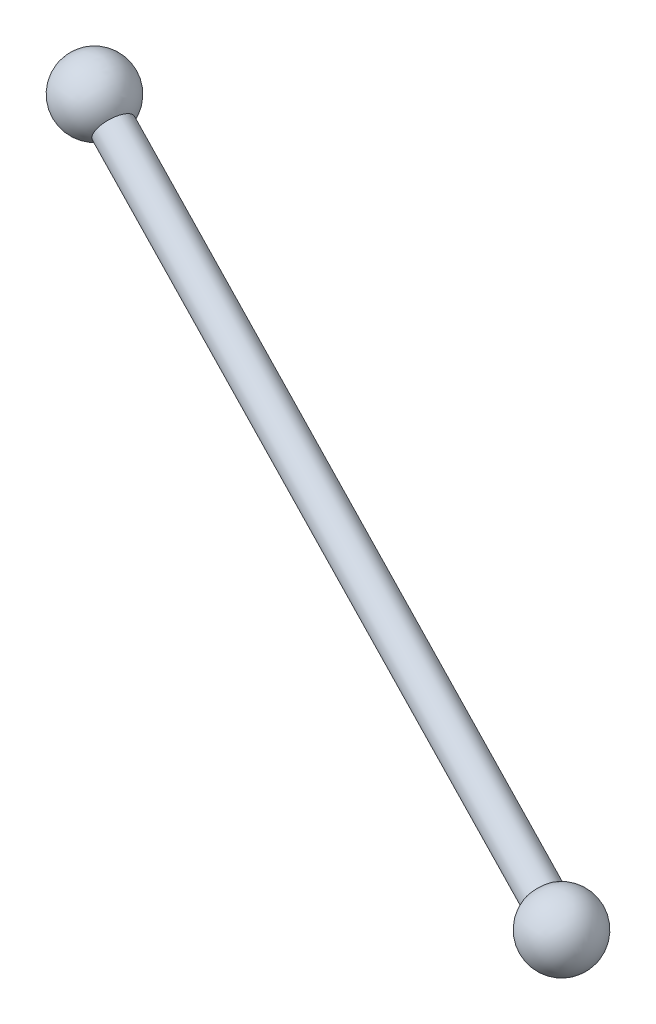
ISO-10303-21;
HEADER;
FILE_DESCRIPTION(('STEP AP214'),'2;1');
FILE_NAME('part.step','',(''),(''),'','','');
FILE_SCHEMA(('AUTOMOTIVE_DESIGN { 1 0 10303 214 1 1 1 1 }'));
ENDSEC;
DATA;
#1=APPLICATION_CONTEXT('core data for automotive mechanical design processes');
#2=APPLICATION_PROTOCOL_DEFINITION('international standard','automotive_design',2000,#1);
#3=PRODUCT_CONTEXT('',#1,'mechanical');
#4=PRODUCT('Part','Part','',(#3));
#5=PRODUCT_RELATED_PRODUCT_CATEGORY('part','',(#4));
#6=PRODUCT_DEFINITION_FORMATION('','',#4);
#7=PRODUCT_DEFINITION_CONTEXT('part definition',#1,'design');
#8=PRODUCT_DEFINITION('design','',#6,#7);
#9=PRODUCT_DEFINITION_SHAPE('','',#8);
#10=(LENGTH_UNIT() NAMED_UNIT(*) SI_UNIT(.MILLI.,.METRE.));
#11=(NAMED_UNIT(*) PLANE_ANGLE_UNIT() SI_UNIT($,.RADIAN.));
#12=(NAMED_UNIT(*) SI_UNIT($,.STERADIAN.) SOLID_ANGLE_UNIT());
#13=UNCERTAINTY_MEASURE_WITH_UNIT(LENGTH_MEASURE(1.E-05),#10,'distance_accuracy_value','');
#14=(GEOMETRIC_REPRESENTATION_CONTEXT(3) GLOBAL_UNCERTAINTY_ASSIGNED_CONTEXT((#13)) GLOBAL_UNIT_ASSIGNED_CONTEXT((#10,
#11,#12)) REPRESENTATION_CONTEXT('',''));
#15=CARTESIAN_POINT('',(0.,0.,0.));
#16=DIRECTION('',(0.,0.,1.));
#17=DIRECTION('',(1.,0.,0.));
#18=AXIS2_PLACEMENT_3D('',#15,#16,#17);
#19=CARTESIAN_POINT('',(-82.272413359275,101.000000000529,-14.9999999999275));
#20=DIRECTION('',(0.,0.,-1.));
#21=DIRECTION('',(-1.,0.,0.));
#22=AXIS2_PLACEMENT_3D('',#19,#20,#21);
#23=SPHERICAL_SURFACE('',#22,3.);
#24=CARTESIAN_POINT('',(-82.272413359275,101.000000000529,-14.9999999999275));
#25=DIRECTION('',(0.869739963853115,-0.435019425763827,0.233046120939382));
#26=DIRECTION('',(0.447336531418006,0.894365712479468,0.));
#27=AXIS2_PLACEMENT_3D('',#24,#25,#26);
#28=SPHERICAL_SURFACE('',#27,3.);
#29=CARTESIAN_POINT('',(-80.0127626491249,99.8697863789751,-14.3945284169668));
#30=DIRECTION('',(0.869739963853112,-0.435019425763826,0.233046120939381));
#31=DIRECTION('',(0.447336531418006,0.894365712479468,0.));
#32=AXIS2_PLACEMENT_3D('',#29,#30,#31);
#33=CIRCLE('',#32,1.5);
#34=CARTESIAN_POINT('',(-79.3417578519979,101.211334947694,-14.3945284169668));
#35=VERTEX_POINT('',#34);
#36=EDGE_CURVE('E43',#35,#35,#33,.F.);
#37=ORIENTED_EDGE('',*,*,#36,.T.);
#38=EDGE_LOOP('',(#37));
#39=FACE_BOUND('',#38,.T.);
#40=ADVANCED_FACE('F39',(#39),#28,.T.);
#41=CARTESIAN_POINT('',(-26.29165124598,73.,0.));
#42=DIRECTION('',(0.,0.,-1.));
#43=DIRECTION('',(-1.,0.,0.));
#44=AXIS2_PLACEMENT_3D('',#41,#42,#43);
#45=SPHERICAL_SURFACE('',#44,3.);
#46=CARTESIAN_POINT('',(-26.29165124598,73.,0.));
#47=DIRECTION('',(-0.869739963853115,0.435019425763826,-0.233046120939381));
#48=DIRECTION('',(-0.447336531418005,-0.894365712479469,0.));
#49=AXIS2_PLACEMENT_3D('',#46,#47,#48);
#50=SPHERICAL_SURFACE('',#49,3.);
#51=CARTESIAN_POINT('',(-28.5513019561301,74.1302136215536,-0.605471582960775));
#52=DIRECTION('',(-0.869739963853115,0.435019425763826,-0.233046120939381));
#53=DIRECTION('',(-0.447336531418005,-0.894365712479469,0.));
#54=AXIS2_PLACEMENT_3D('',#51,#52,#53);
#55=CIRCLE('',#54,1.5);
#56=CARTESIAN_POINT('',(-29.2223067532571,72.7886650528344,-0.605471582960775));
#57=VERTEX_POINT('',#56);
#58=EDGE_CURVE('E10',#57,#57,#55,.F.);
#59=ORIENTED_EDGE('',*,*,#58,.T.);
#60=EDGE_LOOP('',(#59));
#61=FACE_BOUND('',#60,.T.);
#62=ADVANCED_FACE('F54',(#61),#50,.T.);
#63=CARTESIAN_POINT('',(-82.272413359275,101.000000000529,-14.9999999999275));
#64=DIRECTION('',(0.869739963853115,-0.435019425763827,0.233046120939381));
#65=DIRECTION('',(-0.447336531418006,-0.894365712479468,0.));
#66=AXIS2_PLACEMENT_3D('',#63,#64,#65);
#67=CYLINDRICAL_SURFACE('',#66,1.5);
#68=ORIENTED_EDGE('',*,*,#36,.F.);
#69=EDGE_LOOP('',(#68));
#70=FACE_BOUND('',#69,.T.);
#71=ORIENTED_EDGE('',*,*,#58,.F.);
#72=EDGE_LOOP('',(#71));
#73=FACE_BOUND('',#72,.T.);
#74=ADVANCED_FACE('F41',(#70,#73),#67,.T.);
#75=CLOSED_SHELL('',(#40,#62,#74));
#76=MANIFOLD_SOLID_BREP('B2',#75);
#77=ADVANCED_BREP_SHAPE_REPRESENTATION('',(#18,#76),#14);
#78=SHAPE_DEFINITION_REPRESENTATION(#9,#77);
ENDSEC;
END-ISO-10303-21;
